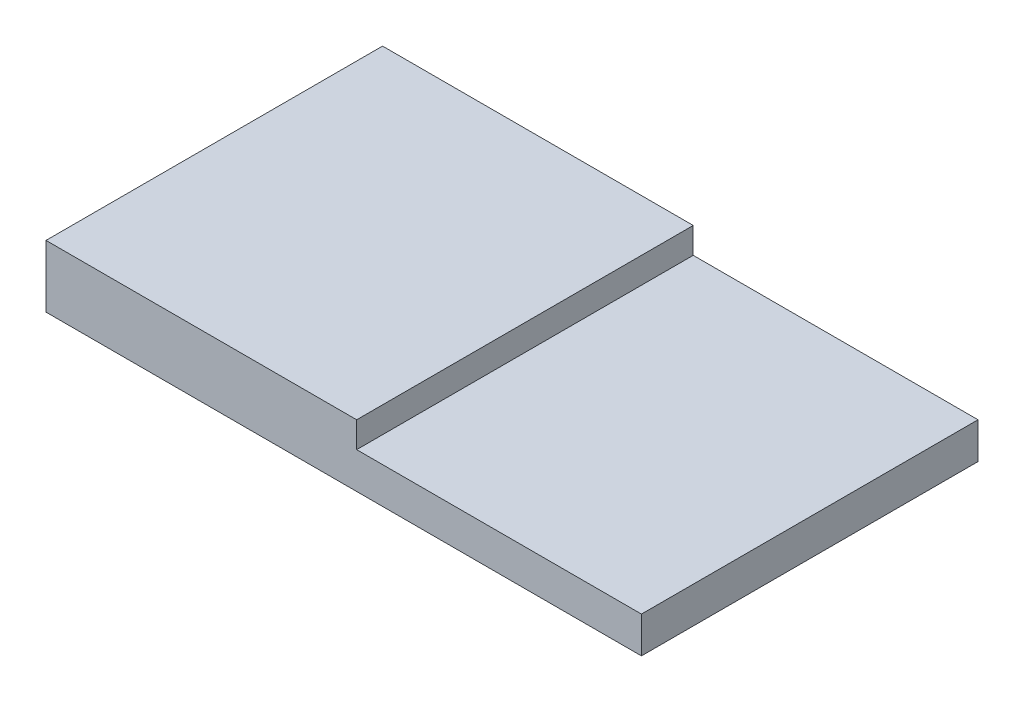
ISO-10303-21;
HEADER;
FILE_DESCRIPTION(('STEP AP214'),'2;1');
FILE_NAME('part.step','',(''),(''),'','','');
FILE_SCHEMA(('AUTOMOTIVE_DESIGN { 1 0 10303 214 1 1 1 1 }'));
ENDSEC;
DATA;
#1=APPLICATION_CONTEXT('core data for automotive mechanical design processes');
#2=APPLICATION_PROTOCOL_DEFINITION('international standard','automotive_design',2000,#1);
#3=PRODUCT_CONTEXT('',#1,'mechanical');
#4=PRODUCT('Part','Part','',(#3));
#5=PRODUCT_RELATED_PRODUCT_CATEGORY('part','',(#4));
#6=PRODUCT_DEFINITION_FORMATION('','',#4);
#7=PRODUCT_DEFINITION_CONTEXT('part definition',#1,'design');
#8=PRODUCT_DEFINITION('design','',#6,#7);
#9=PRODUCT_DEFINITION_SHAPE('','',#8);
#10=(LENGTH_UNIT() NAMED_UNIT(*) SI_UNIT(.MILLI.,.METRE.));
#11=(NAMED_UNIT(*) PLANE_ANGLE_UNIT() SI_UNIT($,.RADIAN.));
#12=(NAMED_UNIT(*) SI_UNIT($,.STERADIAN.) SOLID_ANGLE_UNIT());
#13=UNCERTAINTY_MEASURE_WITH_UNIT(LENGTH_MEASURE(1.E-05),#10,'distance_accuracy_value','');
#14=(GEOMETRIC_REPRESENTATION_CONTEXT(3) GLOBAL_UNCERTAINTY_ASSIGNED_CONTEXT((#13)) GLOBAL_UNIT_ASSIGNED_CONTEXT((#10,
#11,#12)) REPRESENTATION_CONTEXT('',''));
#15=CARTESIAN_POINT('',(0.,0.,0.));
#16=DIRECTION('',(0.,0.,1.));
#17=DIRECTION('',(1.,0.,0.));
#18=AXIS2_PLACEMENT_3D('',#15,#16,#17);
#19=CARTESIAN_POINT('',(-57.5,12.,-32.5));
#20=DIRECTION('',(1.,0.,0.));
#21=DIRECTION('',(0.,0.,-1.));
#22=AXIS2_PLACEMENT_3D('',#19,#20,#21);
#23=PLANE('',#22);
#24=DIRECTION('',(0.,0.,1.));
#25=VECTOR('',#24,1.);
#26=CARTESIAN_POINT('',(-57.5,0.,-32.5));
#27=LINE('',#26,#25);
#28=CARTESIAN_POINT('',(-57.5,0.,-32.5));
#29=VERTEX_POINT('',#28);
#30=CARTESIAN_POINT('',(-57.5,0.,32.5));
#31=VERTEX_POINT('',#30);
#32=EDGE_CURVE('E93',#29,#31,#27,.T.);
#33=ORIENTED_EDGE('',*,*,#32,.T.);
#34=DIRECTION('',(0.,-1.,0.));
#35=VECTOR('',#34,1.);
#36=CARTESIAN_POINT('',(-57.5,12.,32.5));
#37=LINE('',#36,#35);
#38=CARTESIAN_POINT('',(-57.5,12.,32.5));
#39=VERTEX_POINT('',#38);
#40=EDGE_CURVE('E11',#39,#31,#37,.T.);
#41=ORIENTED_EDGE('',*,*,#40,.F.);
#42=DIRECTION('',(0.,0.,1.));
#43=VECTOR('',#42,1.);
#44=CARTESIAN_POINT('',(-57.5,12.,-32.5));
#45=LINE('',#44,#43);
#46=CARTESIAN_POINT('',(-57.5,12.,-32.5));
#47=VERTEX_POINT('',#46);
#48=EDGE_CURVE('E87',#47,#39,#45,.T.);
#49=ORIENTED_EDGE('',*,*,#48,.F.);
#50=DIRECTION('',(0.,-1.,0.));
#51=VECTOR('',#50,1.);
#52=CARTESIAN_POINT('',(-57.5,12.,-32.5));
#53=LINE('',#52,#51);
#54=EDGE_CURVE('E78',#47,#29,#53,.T.);
#55=ORIENTED_EDGE('',*,*,#54,.T.);
#56=EDGE_LOOP('',(#33,#41,#49,#55));
#57=FACE_BOUND('',#56,.T.);
#58=ADVANCED_FACE('F34',(#57),#23,.F.);
#59=CARTESIAN_POINT('',(57.5,12.,32.5));
#60=DIRECTION('',(0.,0.,-1.));
#61=DIRECTION('',(-1.,0.,0.));
#62=AXIS2_PLACEMENT_3D('',#59,#60,#61);
#63=PLANE('',#62);
#64=DIRECTION('',(1.,0.,0.));
#65=VECTOR('',#64,1.);
#66=CARTESIAN_POINT('',(2.50000000000001,7.,32.5));
#67=LINE('',#66,#65);
#68=CARTESIAN_POINT('',(2.50000000000001,7.,32.5));
#69=VERTEX_POINT('',#68);
#70=CARTESIAN_POINT('',(57.5,7.,32.5));
#71=VERTEX_POINT('',#70);
#72=EDGE_CURVE('E132',#69,#71,#67,.T.);
#73=ORIENTED_EDGE('',*,*,#72,.F.);
#74=DIRECTION('',(0.,-1.,0.));
#75=VECTOR('',#74,1.);
#76=CARTESIAN_POINT('',(2.50000000000001,12.,32.5));
#77=LINE('',#76,#75);
#78=CARTESIAN_POINT('',(2.50000000000001,12.,32.5));
#79=VERTEX_POINT('',#78);
#80=EDGE_CURVE('E121',#79,#69,#77,.T.);
#81=ORIENTED_EDGE('',*,*,#80,.F.);
#82=DIRECTION('',(1.,0.,0.));
#83=VECTOR('',#82,1.);
#84=CARTESIAN_POINT('',(57.5,12.,32.5));
#85=LINE('',#84,#83);
#86=EDGE_CURVE('E118',#39,#79,#85,.T.);
#87=ORIENTED_EDGE('',*,*,#86,.F.);
#88=ORIENTED_EDGE('',*,*,#40,.T.);
#89=DIRECTION('',(1.,0.,0.));
#90=VECTOR('',#89,1.);
#91=CARTESIAN_POINT('',(57.5,0.,32.5));
#92=LINE('',#91,#90);
#93=CARTESIAN_POINT('',(57.5,0.,32.5));
#94=VERTEX_POINT('',#93);
#95=EDGE_CURVE('E97',#31,#94,#92,.T.);
#96=ORIENTED_EDGE('',*,*,#95,.T.);
#97=DIRECTION('',(0.,-1.,0.));
#98=VECTOR('',#97,1.);
#99=CARTESIAN_POINT('',(57.5,12.,32.5));
#100=LINE('',#99,#98);
#101=EDGE_CURVE('E41',#71,#94,#100,.T.);
#102=ORIENTED_EDGE('',*,*,#101,.F.);
#103=EDGE_LOOP('',(#73,#81,#87,#88,#96,#102));
#104=FACE_BOUND('',#103,.T.);
#105=ADVANCED_FACE('F115',(#104),#63,.F.);
#106=CARTESIAN_POINT('',(57.5,12.,-32.5));
#107=DIRECTION('',(-1.,0.,0.));
#108=DIRECTION('',(0.,0.,1.));
#109=AXIS2_PLACEMENT_3D('',#106,#107,#108);
#110=PLANE('',#109);
#111=DIRECTION('',(0.,-1.,0.));
#112=VECTOR('',#111,1.);
#113=CARTESIAN_POINT('',(57.5,12.,-32.5));
#114=LINE('',#113,#112);
#115=CARTESIAN_POINT('',(57.5,7.,-32.5));
#116=VERTEX_POINT('',#115);
#117=CARTESIAN_POINT('',(57.5,0.,-32.5));
#118=VERTEX_POINT('',#117);
#119=EDGE_CURVE('E82',#116,#118,#114,.T.);
#120=ORIENTED_EDGE('',*,*,#119,.F.);
#121=DIRECTION('',(0.,0.,1.));
#122=VECTOR('',#121,1.);
#123=CARTESIAN_POINT('',(57.5,7.,-32.5));
#124=LINE('',#123,#122);
#125=EDGE_CURVE('E101',#116,#71,#124,.T.);
#126=ORIENTED_EDGE('',*,*,#125,.T.);
#127=ORIENTED_EDGE('',*,*,#101,.T.);
#128=DIRECTION('',(0.,0.,-1.));
#129=VECTOR('',#128,1.);
#130=CARTESIAN_POINT('',(57.5,0.,-32.5));
#131=LINE('',#130,#129);
#132=EDGE_CURVE('E88',#94,#118,#131,.T.);
#133=ORIENTED_EDGE('',*,*,#132,.T.);
#134=EDGE_LOOP('',(#120,#126,#127,#133));
#135=FACE_BOUND('',#134,.T.);
#136=ADVANCED_FACE('F110',(#135),#110,.F.);
#137=CARTESIAN_POINT('',(57.5,12.,-32.5));
#138=DIRECTION('',(0.,0.,1.));
#139=DIRECTION('',(1.,0.,0.));
#140=AXIS2_PLACEMENT_3D('',#137,#138,#139);
#141=PLANE('',#140);
#142=DIRECTION('',(-1.,0.,0.));
#143=VECTOR('',#142,1.);
#144=CARTESIAN_POINT('',(57.5,12.,-32.5));
#145=LINE('',#144,#143);
#146=CARTESIAN_POINT('',(2.50000000000001,12.,-32.5));
#147=VERTEX_POINT('',#146);
#148=EDGE_CURVE('E56',#147,#47,#145,.T.);
#149=ORIENTED_EDGE('',*,*,#148,.F.);
#150=DIRECTION('',(0.,-1.,0.));
#151=VECTOR('',#150,1.);
#152=CARTESIAN_POINT('',(2.50000000000001,12.,-32.5));
#153=LINE('',#152,#151);
#154=CARTESIAN_POINT('',(2.50000000000001,7.,-32.5));
#155=VERTEX_POINT('',#154);
#156=EDGE_CURVE('E48',#147,#155,#153,.T.);
#157=ORIENTED_EDGE('',*,*,#156,.T.);
#158=DIRECTION('',(1.,0.,0.));
#159=VECTOR('',#158,1.);
#160=CARTESIAN_POINT('',(2.50000000000001,7.,-32.5));
#161=LINE('',#160,#159);
#162=EDGE_CURVE('E128',#155,#116,#161,.T.);
#163=ORIENTED_EDGE('',*,*,#162,.T.);
#164=ORIENTED_EDGE('',*,*,#119,.T.);
#165=DIRECTION('',(-1.,0.,0.));
#166=VECTOR('',#165,1.);
#167=CARTESIAN_POINT('',(57.5,0.,-32.5));
#168=LINE('',#167,#166);
#169=EDGE_CURVE('E75',#118,#29,#168,.T.);
#170=ORIENTED_EDGE('',*,*,#169,.T.);
#171=ORIENTED_EDGE('',*,*,#54,.F.);
#172=EDGE_LOOP('',(#149,#157,#163,#164,#170,#171));
#173=FACE_BOUND('',#172,.T.);
#174=ADVANCED_FACE('F77',(#173),#141,.F.);
#175=CARTESIAN_POINT('',(0.,12.,0.));
#176=DIRECTION('',(0.,-1.,0.));
#177=DIRECTION('',(0.,0.,-1.));
#178=AXIS2_PLACEMENT_3D('',#175,#176,#177);
#179=PLANE('',#178);
#180=ORIENTED_EDGE('',*,*,#86,.T.);
#181=DIRECTION('',(0.,0.,1.));
#182=VECTOR('',#181,1.);
#183=CARTESIAN_POINT('',(2.50000000000001,12.,-32.5));
#184=LINE('',#183,#182);
#185=EDGE_CURVE('E98',#147,#79,#184,.T.);
#186=ORIENTED_EDGE('',*,*,#185,.F.);
#187=ORIENTED_EDGE('',*,*,#148,.T.);
#188=ORIENTED_EDGE('',*,*,#48,.T.);
#189=EDGE_LOOP('',(#180,#186,#187,#188));
#190=FACE_BOUND('',#189,.T.);
#191=ADVANCED_FACE('F122',(#190),#179,.F.);
#192=CARTESIAN_POINT('',(0.,0.,0.));
#193=DIRECTION('',(0.,-1.,0.));
#194=DIRECTION('',(0.,0.,-1.));
#195=AXIS2_PLACEMENT_3D('',#192,#193,#194);
#196=PLANE('',#195);
#197=ORIENTED_EDGE('',*,*,#32,.F.);
#198=ORIENTED_EDGE('',*,*,#169,.F.);
#199=ORIENTED_EDGE('',*,*,#132,.F.);
#200=ORIENTED_EDGE('',*,*,#95,.F.);
#201=EDGE_LOOP('',(#197,#198,#199,#200));
#202=FACE_BOUND('',#201,.T.);
#203=ADVANCED_FACE('F95',(#202),#196,.T.);
#204=CARTESIAN_POINT('',(2.50000000000001,12.,-32.5));
#205=DIRECTION('',(-1.,0.,0.));
#206=DIRECTION('',(0.,0.,1.));
#207=AXIS2_PLACEMENT_3D('',#204,#205,#206);
#208=PLANE('',#207);
#209=DIRECTION('',(0.,0.,1.));
#210=VECTOR('',#209,1.);
#211=CARTESIAN_POINT('',(2.50000000000001,7.,-32.5));
#212=LINE('',#211,#210);
#213=EDGE_CURVE('E125',#155,#69,#212,.T.);
#214=ORIENTED_EDGE('',*,*,#213,.F.);
#215=ORIENTED_EDGE('',*,*,#156,.F.);
#216=ORIENTED_EDGE('',*,*,#185,.T.);
#217=ORIENTED_EDGE('',*,*,#80,.T.);
#218=EDGE_LOOP('',(#214,#215,#216,#217));
#219=FACE_BOUND('',#218,.T.);
#220=ADVANCED_FACE('F136',(#219),#208,.F.);
#221=CARTESIAN_POINT('',(2.50000000000001,7.,-32.5));
#222=DIRECTION('',(0.,-1.,0.));
#223=DIRECTION('',(0.,0.,-1.));
#224=AXIS2_PLACEMENT_3D('',#221,#222,#223);
#225=PLANE('',#224);
#226=ORIENTED_EDGE('',*,*,#125,.F.);
#227=ORIENTED_EDGE('',*,*,#162,.F.);
#228=ORIENTED_EDGE('',*,*,#213,.T.);
#229=ORIENTED_EDGE('',*,*,#72,.T.);
#230=EDGE_LOOP('',(#226,#227,#228,#229));
#231=FACE_BOUND('',#230,.T.);
#232=ADVANCED_FACE('F141',(#231),#225,.F.);
#233=CLOSED_SHELL('',(#58,#105,#136,#174,#191,#203,#220,#232));
#234=MANIFOLD_SOLID_BREP('B2',#233);
#235=ADVANCED_BREP_SHAPE_REPRESENTATION('',(#18,#234),#14);
#236=SHAPE_DEFINITION_REPRESENTATION(#9,#235);
ENDSEC;
END-ISO-10303-21;
